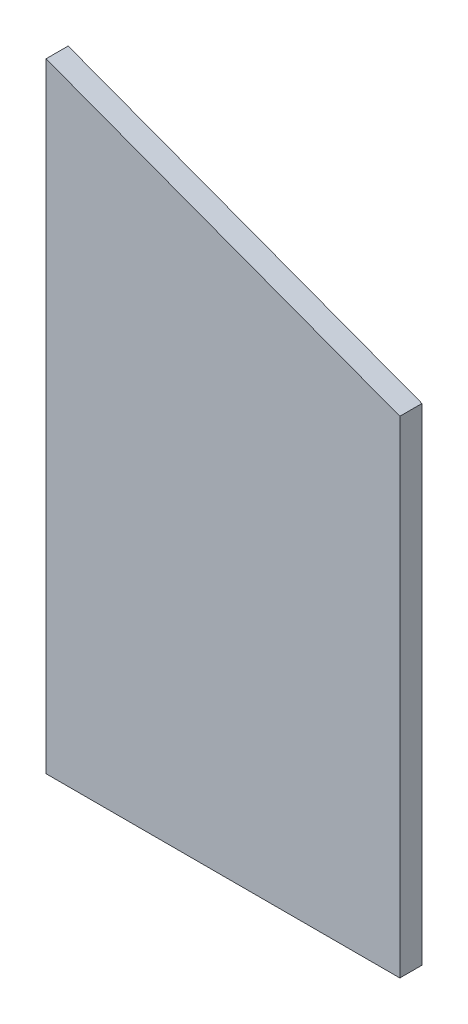
ISO-10303-21;
HEADER;
FILE_DESCRIPTION(('STEP AP214'),'2;1');
FILE_NAME('part.step','',(''),(''),'','','');
FILE_SCHEMA(('AUTOMOTIVE_DESIGN { 1 0 10303 214 1 1 1 1 }'));
ENDSEC;
DATA;
#1=APPLICATION_CONTEXT('core data for automotive mechanical design processes');
#2=APPLICATION_PROTOCOL_DEFINITION('international standard','automotive_design',2000,#1);
#3=PRODUCT_CONTEXT('',#1,'mechanical');
#4=PRODUCT('Part','Part','',(#3));
#5=PRODUCT_RELATED_PRODUCT_CATEGORY('part','',(#4));
#6=PRODUCT_DEFINITION_FORMATION('','',#4);
#7=PRODUCT_DEFINITION_CONTEXT('part definition',#1,'design');
#8=PRODUCT_DEFINITION('design','',#6,#7);
#9=PRODUCT_DEFINITION_SHAPE('','',#8);
#10=(LENGTH_UNIT() NAMED_UNIT(*) SI_UNIT(.MILLI.,.METRE.));
#11=(NAMED_UNIT(*) PLANE_ANGLE_UNIT() SI_UNIT($,.RADIAN.));
#12=(NAMED_UNIT(*) SI_UNIT($,.STERADIAN.) SOLID_ANGLE_UNIT());
#13=UNCERTAINTY_MEASURE_WITH_UNIT(LENGTH_MEASURE(1.E-05),#10,'distance_accuracy_value','');
#14=(GEOMETRIC_REPRESENTATION_CONTEXT(3) GLOBAL_UNCERTAINTY_ASSIGNED_CONTEXT((#13)) GLOBAL_UNIT_ASSIGNED_CONTEXT((#10,
#11,#12)) REPRESENTATION_CONTEXT('',''));
#15=CARTESIAN_POINT('',(0.,0.,0.));
#16=DIRECTION('',(0.,0.,1.));
#17=DIRECTION('',(1.,0.,0.));
#18=AXIS2_PLACEMENT_3D('',#15,#16,#17);
#19=CARTESIAN_POINT('',(101.6,0.,6.35));
#20=DIRECTION('',(0.,1.,0.));
#21=DIRECTION('',(-1.,0.,0.));
#22=AXIS2_PLACEMENT_3D('',#19,#20,#21);
#23=PLANE('',#22);
#24=DIRECTION('',(1.,0.,0.));
#25=VECTOR('',#24,1.);
#26=CARTESIAN_POINT('',(101.6,0.,0.));
#27=LINE('',#26,#25);
#28=CARTESIAN_POINT('',(0.,0.,0.));
#29=VERTEX_POINT('',#28);
#30=CARTESIAN_POINT('',(101.6,0.,0.));
#31=VERTEX_POINT('',#30);
#32=EDGE_CURVE('E111',#29,#31,#27,.T.);
#33=ORIENTED_EDGE('',*,*,#32,.T.);
#34=DIRECTION('',(0.,0.,-1.));
#35=VECTOR('',#34,1.);
#36=CARTESIAN_POINT('',(101.6,0.,6.35));
#37=LINE('',#36,#35);
#38=CARTESIAN_POINT('',(101.6,0.,6.35));
#39=VERTEX_POINT('',#38);
#40=EDGE_CURVE('E11',#39,#31,#37,.T.);
#41=ORIENTED_EDGE('',*,*,#40,.F.);
#42=DIRECTION('',(1.,0.,0.));
#43=VECTOR('',#42,1.);
#44=CARTESIAN_POINT('',(101.6,0.,6.35));
#45=LINE('',#44,#43);
#46=CARTESIAN_POINT('',(0.,0.,6.35));
#47=VERTEX_POINT('',#46);
#48=EDGE_CURVE('E95',#47,#39,#45,.T.);
#49=ORIENTED_EDGE('',*,*,#48,.F.);
#50=DIRECTION('',(0.,0.,-1.));
#51=VECTOR('',#50,1.);
#52=CARTESIAN_POINT('',(0.,0.,6.35));
#53=LINE('',#52,#51);
#54=EDGE_CURVE('E107',#47,#29,#53,.T.);
#55=ORIENTED_EDGE('',*,*,#54,.T.);
#56=EDGE_LOOP('',(#33,#41,#49,#55));
#57=FACE_BOUND('',#56,.T.);
#58=ADVANCED_FACE('F43',(#57),#23,.F.);
#59=CARTESIAN_POINT('',(101.6,139.7,6.35));
#60=DIRECTION('',(-1.,0.,0.));
#61=DIRECTION('',(0.,-1.,0.));
#62=AXIS2_PLACEMENT_3D('',#59,#60,#61);
#63=PLANE('',#62);
#64=DIRECTION('',(0.,1.,0.));
#65=VECTOR('',#64,1.);
#66=CARTESIAN_POINT('',(101.6,139.7,0.));
#67=LINE('',#66,#65);
#68=CARTESIAN_POINT('',(101.6,139.7,0.));
#69=VERTEX_POINT('',#68);
#70=EDGE_CURVE('E100',#31,#69,#67,.T.);
#71=ORIENTED_EDGE('',*,*,#70,.T.);
#72=DIRECTION('',(0.,0.,-1.));
#73=VECTOR('',#72,1.);
#74=CARTESIAN_POINT('',(101.6,139.7,6.35));
#75=LINE('',#74,#73);
#76=CARTESIAN_POINT('',(101.6,139.7,6.35));
#77=VERTEX_POINT('',#76);
#78=EDGE_CURVE('E52',#77,#69,#75,.T.);
#79=ORIENTED_EDGE('',*,*,#78,.F.);
#80=DIRECTION('',(0.,1.,0.));
#81=VECTOR('',#80,1.);
#82=CARTESIAN_POINT('',(101.6,139.7,6.35));
#83=LINE('',#82,#81);
#84=EDGE_CURVE('E90',#39,#77,#83,.T.);
#85=ORIENTED_EDGE('',*,*,#84,.F.);
#86=ORIENTED_EDGE('',*,*,#40,.T.);
#87=EDGE_LOOP('',(#71,#79,#85,#86));
#88=FACE_BOUND('',#87,.T.);
#89=ADVANCED_FACE('F99',(#88),#63,.F.);
#90=CARTESIAN_POINT('',(0.,177.8,6.35));
#91=DIRECTION('',(-0.351123441588392,-0.936329177569044,0.));
#92=DIRECTION('',(0.936329177569045,-0.351123441588392,0.));
#93=AXIS2_PLACEMENT_3D('',#90,#91,#92);
#94=PLANE('',#93);
#95=DIRECTION('',(-0.936329177569044,0.351123441588392,0.));
#96=VECTOR('',#95,1.);
#97=CARTESIAN_POINT('',(0.,177.8,0.));
#98=LINE('',#97,#96);
#99=CARTESIAN_POINT('',(0.,177.8,0.));
#100=VERTEX_POINT('',#99);
#101=EDGE_CURVE('E77',#69,#100,#98,.T.);
#102=ORIENTED_EDGE('',*,*,#101,.T.);
#103=DIRECTION('',(0.,0.,-1.));
#104=VECTOR('',#103,1.);
#105=CARTESIAN_POINT('',(0.,177.8,6.35));
#106=LINE('',#105,#104);
#107=CARTESIAN_POINT('',(0.,177.8,6.35));
#108=VERTEX_POINT('',#107);
#109=EDGE_CURVE('E102',#108,#100,#106,.T.);
#110=ORIENTED_EDGE('',*,*,#109,.F.);
#111=DIRECTION('',(-0.936329177569044,0.351123441588392,0.));
#112=VECTOR('',#111,1.);
#113=CARTESIAN_POINT('',(0.,177.8,6.35));
#114=LINE('',#113,#112);
#115=EDGE_CURVE('E93',#77,#108,#114,.T.);
#116=ORIENTED_EDGE('',*,*,#115,.F.);
#117=ORIENTED_EDGE('',*,*,#78,.T.);
#118=EDGE_LOOP('',(#102,#110,#116,#117));
#119=FACE_BOUND('',#118,.T.);
#120=ADVANCED_FACE('F103',(#119),#94,.F.);
#121=CARTESIAN_POINT('',(0.,0.,6.35));
#122=DIRECTION('',(1.,0.,0.));
#123=DIRECTION('',(0.,0.,-1.));
#124=AXIS2_PLACEMENT_3D('',#121,#122,#123);
#125=PLANE('',#124);
#126=DIRECTION('',(0.,-1.,0.));
#127=VECTOR('',#126,1.);
#128=CARTESIAN_POINT('',(0.,0.,0.));
#129=LINE('',#128,#127);
#130=EDGE_CURVE('E83',#100,#29,#129,.T.);
#131=ORIENTED_EDGE('',*,*,#130,.T.);
#132=ORIENTED_EDGE('',*,*,#54,.F.);
#133=DIRECTION('',(0.,-1.,0.));
#134=VECTOR('',#133,1.);
#135=CARTESIAN_POINT('',(0.,0.,6.35));
#136=LINE('',#135,#134);
#137=EDGE_CURVE('E60',#108,#47,#136,.T.);
#138=ORIENTED_EDGE('',*,*,#137,.F.);
#139=ORIENTED_EDGE('',*,*,#109,.T.);
#140=EDGE_LOOP('',(#131,#132,#138,#139));
#141=FACE_BOUND('',#140,.T.);
#142=ADVANCED_FACE('F124',(#141),#125,.F.);
#143=CARTESIAN_POINT('',(0.,0.,6.35));
#144=DIRECTION('',(0.,0.,-1.));
#145=DIRECTION('',(-1.,0.,0.));
#146=AXIS2_PLACEMENT_3D('',#143,#144,#145);
#147=PLANE('',#146);
#148=ORIENTED_EDGE('',*,*,#48,.T.);
#149=ORIENTED_EDGE('',*,*,#84,.T.);
#150=ORIENTED_EDGE('',*,*,#115,.T.);
#151=ORIENTED_EDGE('',*,*,#137,.T.);
#152=EDGE_LOOP('',(#148,#149,#150,#151));
#153=FACE_BOUND('',#152,.T.);
#154=ADVANCED_FACE('F91',(#153),#147,.F.);
#155=CARTESIAN_POINT('',(0.,0.,0.));
#156=DIRECTION('',(0.,0.,-1.));
#157=DIRECTION('',(-1.,0.,0.));
#158=AXIS2_PLACEMENT_3D('',#155,#156,#157);
#159=PLANE('',#158);
#160=ORIENTED_EDGE('',*,*,#32,.F.);
#161=ORIENTED_EDGE('',*,*,#130,.F.);
#162=ORIENTED_EDGE('',*,*,#101,.F.);
#163=ORIENTED_EDGE('',*,*,#70,.F.);
#164=EDGE_LOOP('',(#160,#161,#162,#163));
#165=FACE_BOUND('',#164,.T.);
#166=ADVANCED_FACE('F127',(#165),#159,.T.);
#167=CLOSED_SHELL('',(#58,#89,#120,#142,#154,#166));
#168=MANIFOLD_SOLID_BREP('B2',#167);
#169=ADVANCED_BREP_SHAPE_REPRESENTATION('',(#18,#168),#14);
#170=SHAPE_DEFINITION_REPRESENTATION(#9,#169);
ENDSEC;
END-ISO-10303-21;
